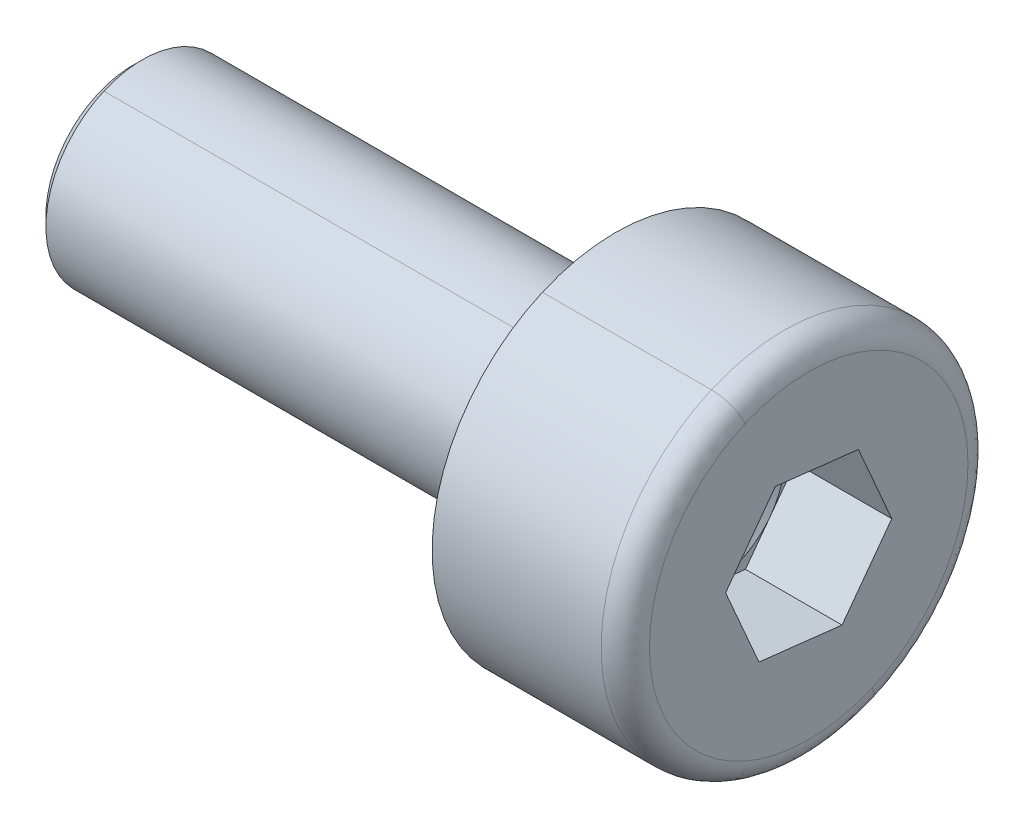
ISO-10303-21;
HEADER;
FILE_DESCRIPTION(('STEP AP214'),'2;1');
FILE_NAME('part.step','',(''),(''),'','','');
FILE_SCHEMA(('AUTOMOTIVE_DESIGN { 1 0 10303 214 1 1 1 1 }'));
ENDSEC;
DATA;
#1=APPLICATION_CONTEXT('core data for automotive mechanical design processes');
#2=APPLICATION_PROTOCOL_DEFINITION('international standard','automotive_design',2000,#1);
#3=PRODUCT_CONTEXT('',#1,'mechanical');
#4=PRODUCT('Part','Part','',(#3));
#5=PRODUCT_RELATED_PRODUCT_CATEGORY('part','',(#4));
#6=PRODUCT_DEFINITION_FORMATION('','',#4);
#7=PRODUCT_DEFINITION_CONTEXT('part definition',#1,'design');
#8=PRODUCT_DEFINITION('design','',#6,#7);
#9=PRODUCT_DEFINITION_SHAPE('','',#8);
#10=(LENGTH_UNIT() NAMED_UNIT(*) SI_UNIT(.MILLI.,.METRE.));
#11=(NAMED_UNIT(*) PLANE_ANGLE_UNIT() SI_UNIT($,.RADIAN.));
#12=(NAMED_UNIT(*) SI_UNIT($,.STERADIAN.) SOLID_ANGLE_UNIT());
#13=UNCERTAINTY_MEASURE_WITH_UNIT(LENGTH_MEASURE(1.E-05),#10,'distance_accuracy_value','');
#14=(GEOMETRIC_REPRESENTATION_CONTEXT(3) GLOBAL_UNCERTAINTY_ASSIGNED_CONTEXT((#13)) GLOBAL_UNIT_ASSIGNED_CONTEXT((#10,
#11,#12)) REPRESENTATION_CONTEXT('',''));
#15=CARTESIAN_POINT('',(0.,0.,0.));
#16=DIRECTION('',(0.,0.,1.));
#17=DIRECTION('',(1.,0.,0.));
#18=AXIS2_PLACEMENT_3D('',#15,#16,#17);
#19=CARTESIAN_POINT('',(31.89999999991,0.,17.));
#20=DIRECTION('',(1.,0.,0.));
#21=DIRECTION('',(0.,-0.917051136198339,-0.398769624717501));
#22=AXIS2_PLACEMENT_3D('',#19,#20,#21);
#23=CONICAL_SURFACE('',#22,0.749999999698048,1.04719755078461);
#24=DIRECTION('',(0.500000000356795,0.794189580328236,0.345344625180799));
#25=VECTOR('',#24,1.);
#26=CARTESIAN_POINT('',(31.89999999991,0.687788351871846,17.2990772184177));
#27=LINE('',#26,#25);
#28=CARTESIAN_POINT('',(31.4669872980623,-3.12772561488158E-10,16.999999999864));
#29=VERTEX_POINT('',#28);
#30=CARTESIAN_POINT('',(31.9000000000412,0.687788352080363,17.2990772185084));
#31=VERTEX_POINT('',#30);
#32=EDGE_CURVE('E209',#29,#31,#27,.T.);
#33=ORIENTED_EDGE('',*,*,#32,.F.);
#34=DIRECTION('',(0.500000000356795,-0.794189580328236,-0.345344625180799));
#35=VECTOR('',#34,1.);
#36=CARTESIAN_POINT('',(31.89999999991,-0.687788351871851,16.7009227815823));
#37=LINE('',#36,#35);
#38=CARTESIAN_POINT('',(31.9000000000412,-0.687788352080368,16.7009227814916));
#39=VERTEX_POINT('',#38);
#40=EDGE_CURVE('E203',#29,#39,#37,.T.);
#41=ORIENTED_EDGE('',*,*,#40,.T.);
#42=CARTESIAN_POINT('',(31.9000000000412,0.,17.));
#43=DIRECTION('',(-1.,0.,0.));
#44=DIRECTION('',(0.,-0.917051136198324,-0.398769624717534));
#45=AXIS2_PLACEMENT_3D('',#42,#43,#44);
#46=CIRCLE('',#45,0.749999999925422);
#47=CARTESIAN_POINT('',(31.9000000000206,-0.446103576096618,16.3970973550084));
#48=VERTEX_POINT('',#47);
#49=EDGE_CURVE('E11',#48,#39,#46,.T.);
#50=ORIENTED_EDGE('',*,*,#49,.F.);
#51=CARTESIAN_POINT('',(31.9000000000412,0.,17.));
#52=DIRECTION('',(-1.,0.,0.));
#53=DIRECTION('',(0.,-0.917051136198336,-0.398769624717506));
#54=AXIS2_PLACEMENT_3D('',#51,#52,#53);
#55=CIRCLE('',#54,0.749999999925422);
#56=CARTESIAN_POINT('',(31.9000000000206,0.299077218523254,16.3122116478855));
#57=VERTEX_POINT('',#56);
#58=EDGE_CURVE('E27',#57,#48,#55,.T.);
#59=ORIENTED_EDGE('',*,*,#58,.F.);
#60=CARTESIAN_POINT('',(31.9000000000412,0.,17.));
#61=DIRECTION('',(-1.,0.,0.));
#62=DIRECTION('',(0.,-0.917051136198338,-0.398769624717502));
#63=AXIS2_PLACEMENT_3D('',#60,#61,#62);
#64=CIRCLE('',#63,0.749999999925421);
#65=CARTESIAN_POINT('',(31.9000000000206,0.745180794619869,16.915114292877));
#66=VERTEX_POINT('',#65);
#67=EDGE_CURVE('E231',#66,#57,#64,.T.);
#68=ORIENTED_EDGE('',*,*,#67,.F.);
#69=CARTESIAN_POINT('',(31.9000000000412,0.,17.));
#70=DIRECTION('',(-1.,0.,0.));
#71=DIRECTION('',(0.,-0.917051136198336,-0.398769624717506));
#72=AXIS2_PLACEMENT_3D('',#69,#70,#71);
#73=CIRCLE('',#72,0.749999999925421);
#74=EDGE_CURVE('E234',#31,#66,#73,.T.);
#75=ORIENTED_EDGE('',*,*,#74,.F.);
#76=EDGE_LOOP('',(#33,#41,#50,#59,#68,#75));
#77=FACE_BOUND('',#76,.T.);
#78=ADVANCED_FACE('F16',(#77),#23,.F.);
#79=CARTESIAN_POINT('',(31.9,-0.598154437076255,18.3755767042975));
#80=DIRECTION('',(1.,0.,0.));
#81=DIRECTION('',(0.,1.,0.));
#82=AXIS2_PLACEMENT_3D('',#79,#80,#81);
#83=PLANE('',#82);
#84=CARTESIAN_POINT('',(31.9000000000412,0.,17.));
#85=DIRECTION('',(-1.,0.,0.));
#86=DIRECTION('',(0.,-0.917051136198338,-0.398769624717502));
#87=AXIS2_PLACEMENT_3D('',#84,#85,#86);
#88=CIRCLE('',#87,0.749999999925421);
#89=CARTESIAN_POINT('',(31.9000000000206,-0.745180794619875,17.084885707123));
#90=VERTEX_POINT('',#89);
#91=CARTESIAN_POINT('',(31.9000000000206,-0.299077218523259,17.6877883521146));
#92=VERTEX_POINT('',#91);
#93=EDGE_CURVE('E205',#90,#92,#88,.T.);
#94=ORIENTED_EDGE('',*,*,#93,.T.);
#95=DIRECTION('',(0.,0.917051136198338,0.398769624717501));
#96=VECTOR('',#95,1.);
#97=CARTESIAN_POINT('',(31.9,-0.696172008796701,17.5151160395173));
#98=LINE('',#97,#96);
#99=CARTESIAN_POINT('',(31.9,-0.696172008796701,17.5151160395173));
#100=VERTEX_POINT('',#99);
#101=EDGE_CURVE('E42',#100,#92,#98,.T.);
#102=ORIENTED_EDGE('',*,*,#101,.F.);
#103=DIRECTION('',(0.,0.113180942836226,0.993574392875895));
#104=VECTOR('',#103,1.);
#105=CARTESIAN_POINT('',(31.9,-0.794189580517147,16.6546553747371));
#106=LINE('',#105,#104);
#107=EDGE_CURVE('E311',#90,#100,#106,.T.);
#108=ORIENTED_EDGE('',*,*,#107,.F.);
#109=EDGE_LOOP('',(#94,#102,#108));
#110=FACE_BOUND('',#109,.T.);
#111=ADVANCED_FACE('F436',(#110),#83,.T.);
#112=CARTESIAN_POINT('',(31.9,-0.598154437076255,18.3755767042975));
#113=DIRECTION('',(1.,0.,0.));
#114=DIRECTION('',(0.,1.,0.));
#115=AXIS2_PLACEMENT_3D('',#112,#113,#114);
#116=PLANE('',#115);
#117=ORIENTED_EDGE('',*,*,#49,.T.);
#118=CARTESIAN_POINT('',(31.9000000000412,0.,17.));
#119=DIRECTION('',(-1.,0.,0.));
#120=DIRECTION('',(0.,-0.917051136198338,-0.398769624717501));
#121=AXIS2_PLACEMENT_3D('',#118,#119,#120);
#122=CIRCLE('',#121,0.749999999925422);
#123=EDGE_CURVE('E192',#39,#90,#122,.T.);
#124=ORIENTED_EDGE('',*,*,#123,.T.);
#125=DIRECTION('',(0.,0.113180942836226,0.993574392875895));
#126=VECTOR('',#125,1.);
#127=CARTESIAN_POINT('',(31.9,-0.794189580517147,16.6546553747371));
#128=LINE('',#127,#126);
#129=CARTESIAN_POINT('',(31.9,-0.794189580517147,16.6546553747371));
#130=VERTEX_POINT('',#129);
#131=EDGE_CURVE('E290',#130,#90,#128,.T.);
#132=ORIENTED_EDGE('',*,*,#131,.F.);
#133=DIRECTION('',(0.,-0.803870193362113,0.594804768158393));
#134=VECTOR('',#133,1.);
#135=CARTESIAN_POINT('',(31.9,-0.0980175717204487,16.1395393352198));
#136=LINE('',#135,#134);
#137=EDGE_CURVE('E195',#48,#130,#136,.T.);
#138=ORIENTED_EDGE('',*,*,#137,.F.);
#139=EDGE_LOOP('',(#117,#124,#132,#138));
#140=FACE_BOUND('',#139,.T.);
#141=ADVANCED_FACE('F191',(#140),#116,.T.);
#142=CARTESIAN_POINT('',(31.9,-0.598154437076255,18.3755767042975));
#143=DIRECTION('',(1.,0.,0.));
#144=DIRECTION('',(0.,1.,0.));
#145=AXIS2_PLACEMENT_3D('',#142,#143,#144);
#146=PLANE('',#145);
#147=ORIENTED_EDGE('',*,*,#58,.T.);
#148=DIRECTION('',(0.,-0.803870193362113,0.594804768158393));
#149=VECTOR('',#148,1.);
#150=CARTESIAN_POINT('',(31.9,-0.0980175717204487,16.1395393352198));
#151=LINE('',#150,#149);
#152=CARTESIAN_POINT('',(31.9,-0.0980175717204487,16.1395393352198));
#153=VERTEX_POINT('',#152);
#154=EDGE_CURVE('E300',#153,#48,#151,.T.);
#155=ORIENTED_EDGE('',*,*,#154,.F.);
#156=DIRECTION('',(0.,-0.917051136198338,-0.398769624717501));
#157=VECTOR('',#156,1.);
#158=CARTESIAN_POINT('',(31.9,0.696172008796695,16.4848839604827));
#159=LINE('',#158,#157);
#160=EDGE_CURVE('E307',#57,#153,#159,.T.);
#161=ORIENTED_EDGE('',*,*,#160,.F.);
#162=EDGE_LOOP('',(#147,#155,#161));
#163=FACE_BOUND('',#162,.T.);
#164=ADVANCED_FACE('F457',(#163),#146,.T.);
#165=CARTESIAN_POINT('',(31.9,-0.598154437076255,18.3755767042975));
#166=DIRECTION('',(1.,0.,0.));
#167=DIRECTION('',(0.,1.,0.));
#168=AXIS2_PLACEMENT_3D('',#165,#166,#167);
#169=PLANE('',#168);
#170=ORIENTED_EDGE('',*,*,#67,.T.);
#171=DIRECTION('',(0.,-0.917051136198338,-0.398769624717501));
#172=VECTOR('',#171,1.);
#173=CARTESIAN_POINT('',(31.9,0.696172008796695,16.4848839604827));
#174=LINE('',#173,#172);
#175=CARTESIAN_POINT('',(31.9,0.696172008796695,16.4848839604827));
#176=VERTEX_POINT('',#175);
#177=EDGE_CURVE('E321',#176,#57,#174,.T.);
#178=ORIENTED_EDGE('',*,*,#177,.F.);
#179=DIRECTION('',(0.,-0.113180942836226,-0.993574392875895));
#180=VECTOR('',#179,1.);
#181=CARTESIAN_POINT('',(31.9,0.794189580517142,17.3453446252629));
#182=LINE('',#181,#180);
#183=EDGE_CURVE('E20',#66,#176,#182,.T.);
#184=ORIENTED_EDGE('',*,*,#183,.F.);
#185=EDGE_LOOP('',(#170,#178,#184));
#186=FACE_BOUND('',#185,.T.);
#187=ADVANCED_FACE('F449',(#186),#169,.T.);
#188=CARTESIAN_POINT('',(31.9,-0.598154437076255,18.3755767042975));
#189=DIRECTION('',(1.,0.,0.));
#190=DIRECTION('',(0.,1.,0.));
#191=AXIS2_PLACEMENT_3D('',#188,#189,#190);
#192=PLANE('',#191);
#193=CARTESIAN_POINT('',(31.9000000000412,0.,17.));
#194=DIRECTION('',(-1.,0.,0.));
#195=DIRECTION('',(0.,-0.917051136198336,-0.398769624717506));
#196=AXIS2_PLACEMENT_3D('',#193,#194,#195);
#197=CIRCLE('',#196,0.749999999925422);
#198=CARTESIAN_POINT('',(31.9000000000206,0.446103576096613,17.6029026449916));
#199=VERTEX_POINT('',#198);
#200=EDGE_CURVE('E336',#92,#199,#197,.T.);
#201=ORIENTED_EDGE('',*,*,#200,.T.);
#202=DIRECTION('',(0.,0.803870193362112,-0.594804768158393));
#203=VECTOR('',#202,1.);
#204=CARTESIAN_POINT('',(31.9,0.098017571720444,17.8604606647802));
#205=LINE('',#204,#203);
#206=CARTESIAN_POINT('',(31.9,0.0980175717204439,17.8604606647802));
#207=VERTEX_POINT('',#206);
#208=EDGE_CURVE('E253',#207,#199,#205,.T.);
#209=ORIENTED_EDGE('',*,*,#208,.F.);
#210=DIRECTION('',(0.,0.917051136198338,0.398769624717501));
#211=VECTOR('',#210,1.);
#212=CARTESIAN_POINT('',(31.9,-0.696172008796701,17.5151160395173));
#213=LINE('',#212,#211);
#214=EDGE_CURVE('E235',#92,#207,#213,.T.);
#215=ORIENTED_EDGE('',*,*,#214,.F.);
#216=EDGE_LOOP('',(#201,#209,#215));
#217=FACE_BOUND('',#216,.T.);
#218=ADVANCED_FACE('F446',(#217),#192,.T.);
#219=CARTESIAN_POINT('',(31.9,-0.598154437076255,18.3755767042975));
#220=DIRECTION('',(1.,0.,0.));
#221=DIRECTION('',(0.,1.,0.));
#222=AXIS2_PLACEMENT_3D('',#219,#220,#221);
#223=PLANE('',#222);
#224=CARTESIAN_POINT('',(31.9000000000412,0.,17.));
#225=DIRECTION('',(-1.,0.,0.));
#226=DIRECTION('',(0.,-0.91705113619834,-0.398769624717497));
#227=AXIS2_PLACEMENT_3D('',#224,#225,#226);
#228=CIRCLE('',#227,0.749999999925422);
#229=EDGE_CURVE('E216',#199,#31,#228,.T.);
#230=ORIENTED_EDGE('',*,*,#229,.T.);
#231=ORIENTED_EDGE('',*,*,#74,.T.);
#232=DIRECTION('',(0.,-0.113180942836226,-0.993574392875895));
#233=VECTOR('',#232,1.);
#234=CARTESIAN_POINT('',(31.9,0.794189580517142,17.3453446252629));
#235=LINE('',#234,#233);
#236=CARTESIAN_POINT('',(31.9,0.794189580517142,17.3453446252629));
#237=VERTEX_POINT('',#236);
#238=EDGE_CURVE('E303',#237,#66,#235,.T.);
#239=ORIENTED_EDGE('',*,*,#238,.F.);
#240=DIRECTION('',(0.,0.803870193362112,-0.594804768158393));
#241=VECTOR('',#240,1.);
#242=CARTESIAN_POINT('',(31.9,0.098017571720444,17.8604606647802));
#243=LINE('',#242,#241);
#244=EDGE_CURVE('E240',#199,#237,#243,.T.);
#245=ORIENTED_EDGE('',*,*,#244,.F.);
#246=EDGE_LOOP('',(#230,#231,#239,#245));
#247=FACE_BOUND('',#246,.T.);
#248=ADVANCED_FACE('F448',(#247),#223,.T.);
#249=CARTESIAN_POINT('',(31.9,-0.696172008796701,17.5151160395173));
#250=DIRECTION('',(0.,0.398769624717501,-0.917051136198338));
#251=DIRECTION('',(-1.,0.,0.));
#252=AXIS2_PLACEMENT_3D('',#249,#250,#251);
#253=PLANE('',#252);
#254=ORIENTED_EDGE('',*,*,#214,.T.);
#255=DIRECTION('',(-1.,0.,0.));
#256=VECTOR('',#255,1.);
#257=CARTESIAN_POINT('',(31.9,0.098017571720444,17.8604606647802));
#258=LINE('',#257,#256);
#259=CARTESIAN_POINT('',(32.9,0.098017571720444,17.8604606647802));
#260=VERTEX_POINT('',#259);
#261=EDGE_CURVE('E239',#260,#207,#258,.T.);
#262=ORIENTED_EDGE('',*,*,#261,.F.);
#263=DIRECTION('',(0.,-0.917051136198338,-0.398769624717501));
#264=VECTOR('',#263,1.);
#265=CARTESIAN_POINT('',(32.9,-0.299077218538129,17.6877883521488));
#266=LINE('',#265,#264);
#267=CARTESIAN_POINT('',(32.9,-0.696172008796701,17.5151160395173));
#268=VERTEX_POINT('',#267);
#269=EDGE_CURVE('E245',#260,#268,#266,.T.);
#270=ORIENTED_EDGE('',*,*,#269,.T.);
#271=DIRECTION('',(1.,0.,0.));
#272=VECTOR('',#271,1.);
#273=CARTESIAN_POINT('',(31.9,-0.696172008796701,17.5151160395173));
#274=LINE('',#273,#272);
#275=EDGE_CURVE('E293',#100,#268,#274,.T.);
#276=ORIENTED_EDGE('',*,*,#275,.F.);
#277=ORIENTED_EDGE('',*,*,#101,.T.);
#278=EDGE_LOOP('',(#254,#262,#270,#276,#277));
#279=FACE_BOUND('',#278,.T.);
#280=ADVANCED_FACE('F454',(#279),#253,.T.);
#281=CARTESIAN_POINT('',(31.9,-0.794189580517147,16.6546553747371));
#282=DIRECTION('',(0.,0.993574392875895,-0.113180942836226));
#283=DIRECTION('',(-1.,0.,0.));
#284=AXIS2_PLACEMENT_3D('',#281,#282,#283);
#285=PLANE('',#284);
#286=ORIENTED_EDGE('',*,*,#107,.T.);
#287=ORIENTED_EDGE('',*,*,#275,.T.);
#288=DIRECTION('',(0.,-0.113180942836226,-0.993574392875895));
#289=VECTOR('',#288,1.);
#290=CARTESIAN_POINT('',(32.9,-0.696172008796701,17.5151160395173));
#291=LINE('',#290,#289);
#292=CARTESIAN_POINT('',(32.9,-0.794189580517147,16.6546553747371));
#293=VERTEX_POINT('',#292);
#294=EDGE_CURVE('E249',#268,#293,#291,.T.);
#295=ORIENTED_EDGE('',*,*,#294,.T.);
#296=DIRECTION('',(1.,0.,0.));
#297=VECTOR('',#296,1.);
#298=CARTESIAN_POINT('',(31.9,-0.794189580517147,16.6546553747371));
#299=LINE('',#298,#297);
#300=EDGE_CURVE('E297',#130,#293,#299,.T.);
#301=ORIENTED_EDGE('',*,*,#300,.F.);
#302=ORIENTED_EDGE('',*,*,#131,.T.);
#303=EDGE_LOOP('',(#286,#287,#295,#301,#302));
#304=FACE_BOUND('',#303,.T.);
#305=ADVANCED_FACE('F471',(#304),#285,.T.);
#306=CARTESIAN_POINT('',(31.9,-0.0980175717204487,16.1395393352198));
#307=DIRECTION('',(0.,0.594804768158393,0.803870193362113));
#308=DIRECTION('',(1.,0.,0.));
#309=AXIS2_PLACEMENT_3D('',#306,#307,#308);
#310=PLANE('',#309);
#311=ORIENTED_EDGE('',*,*,#137,.T.);
#312=ORIENTED_EDGE('',*,*,#300,.T.);
#313=DIRECTION('',(0.,0.803870193362113,-0.594804768158393));
#314=VECTOR('',#313,1.);
#315=CARTESIAN_POINT('',(32.9,-0.794189580517147,16.6546553747371));
#316=LINE('',#315,#314);
#317=CARTESIAN_POINT('',(32.9,-0.0980175717204487,16.1395393352198));
#318=VERTEX_POINT('',#317);
#319=EDGE_CURVE('E263',#293,#318,#316,.T.);
#320=ORIENTED_EDGE('',*,*,#319,.T.);
#321=DIRECTION('',(1.,0.,0.));
#322=VECTOR('',#321,1.);
#323=CARTESIAN_POINT('',(31.9,-0.0980175717204487,16.1395393352198));
#324=LINE('',#323,#322);
#325=EDGE_CURVE('E325',#153,#318,#324,.T.);
#326=ORIENTED_EDGE('',*,*,#325,.F.);
#327=ORIENTED_EDGE('',*,*,#154,.T.);
#328=EDGE_LOOP('',(#311,#312,#320,#326,#327));
#329=FACE_BOUND('',#328,.T.);
#330=ADVANCED_FACE('F444',(#329),#310,.T.);
#331=CARTESIAN_POINT('',(31.9,0.696172008796695,16.4848839604827));
#332=DIRECTION('',(0.,-0.398769624717501,0.917051136198338));
#333=DIRECTION('',(-1.,0.,0.));
#334=AXIS2_PLACEMENT_3D('',#331,#332,#333);
#335=PLANE('',#334);
#336=ORIENTED_EDGE('',*,*,#160,.T.);
#337=ORIENTED_EDGE('',*,*,#325,.T.);
#338=DIRECTION('',(0.,0.917051136198338,0.398769624717501));
#339=VECTOR('',#338,1.);
#340=CARTESIAN_POINT('',(32.9,0.299077218538123,16.3122116478513));
#341=LINE('',#340,#339);
#342=CARTESIAN_POINT('',(32.9,0.696172008796695,16.4848839604827));
#343=VERTEX_POINT('',#342);
#344=EDGE_CURVE('E289',#318,#343,#341,.T.);
#345=ORIENTED_EDGE('',*,*,#344,.T.);
#346=DIRECTION('',(1.,0.,0.));
#347=VECTOR('',#346,1.);
#348=CARTESIAN_POINT('',(31.9,0.696172008796695,16.4848839604827));
#349=LINE('',#348,#347);
#350=EDGE_CURVE('E308',#176,#343,#349,.T.);
#351=ORIENTED_EDGE('',*,*,#350,.F.);
#352=ORIENTED_EDGE('',*,*,#177,.T.);
#353=EDGE_LOOP('',(#336,#337,#345,#351,#352));
#354=FACE_BOUND('',#353,.T.);
#355=ADVANCED_FACE('F441',(#354),#335,.T.);
#356=CARTESIAN_POINT('',(31.9,0.794189580517142,17.3453446252629));
#357=DIRECTION('',(0.,-0.993574392875895,0.113180942836226));
#358=DIRECTION('',(-1.,0.,0.));
#359=AXIS2_PLACEMENT_3D('',#356,#357,#358);
#360=PLANE('',#359);
#361=ORIENTED_EDGE('',*,*,#183,.T.);
#362=ORIENTED_EDGE('',*,*,#350,.T.);
#363=DIRECTION('',(0.,0.113180942836226,0.993574392875895));
#364=VECTOR('',#363,1.);
#365=CARTESIAN_POINT('',(32.9,0.696172008796695,16.4848839604827));
#366=LINE('',#365,#364);
#367=CARTESIAN_POINT('',(32.9,0.794189580517142,17.3453446252629));
#368=VERTEX_POINT('',#367);
#369=EDGE_CURVE('E275',#343,#368,#366,.T.);
#370=ORIENTED_EDGE('',*,*,#369,.T.);
#371=DIRECTION('',(1.,0.,0.));
#372=VECTOR('',#371,1.);
#373=CARTESIAN_POINT('',(31.9,0.794189580517142,17.3453446252629));
#374=LINE('',#373,#372);
#375=EDGE_CURVE('E236',#237,#368,#374,.T.);
#376=ORIENTED_EDGE('',*,*,#375,.F.);
#377=ORIENTED_EDGE('',*,*,#238,.T.);
#378=EDGE_LOOP('',(#361,#362,#370,#376,#377));
#379=FACE_BOUND('',#378,.T.);
#380=ADVANCED_FACE('F429',(#379),#360,.T.);
#381=CARTESIAN_POINT('',(31.9,0.098017571720444,17.8604606647802));
#382=DIRECTION('',(0.,-0.594804768158393,-0.803870193362113));
#383=DIRECTION('',(0.,-0.803870193362113,0.594804768158393));
#384=AXIS2_PLACEMENT_3D('',#381,#382,#383);
#385=PLANE('',#384);
#386=ORIENTED_EDGE('',*,*,#244,.T.);
#387=ORIENTED_EDGE('',*,*,#375,.T.);
#388=DIRECTION('',(0.,-0.803870193362112,0.594804768158393));
#389=VECTOR('',#388,1.);
#390=CARTESIAN_POINT('',(32.9,0.794189580517142,17.3453446252629));
#391=LINE('',#390,#389);
#392=EDGE_CURVE('E248',#368,#260,#391,.T.);
#393=ORIENTED_EDGE('',*,*,#392,.T.);
#394=ORIENTED_EDGE('',*,*,#261,.T.);
#395=ORIENTED_EDGE('',*,*,#208,.T.);
#396=EDGE_LOOP('',(#386,#387,#393,#394,#395));
#397=FACE_BOUND('',#396,.T.);
#398=ADVANCED_FACE('F421',(#397),#385,.T.);
#399=CARTESIAN_POINT('',(32.9,0.,17.));
#400=DIRECTION('',(-1.,0.,0.));
#401=DIRECTION('',(0.,0.,1.));
#402=AXIS2_PLACEMENT_3D('',#399,#400,#401);
#403=PLANE('',#402);
#404=ORIENTED_EDGE('',*,*,#369,.F.);
#405=ORIENTED_EDGE('',*,*,#344,.F.);
#406=ORIENTED_EDGE('',*,*,#319,.F.);
#407=ORIENTED_EDGE('',*,*,#294,.F.);
#408=ORIENTED_EDGE('',*,*,#269,.F.);
#409=ORIENTED_EDGE('',*,*,#392,.F.);
#410=EDGE_LOOP('',(#404,#405,#406,#407,#408,#409));
#411=FACE_BOUND('',#410,.T.);
#412=CARTESIAN_POINT('',(32.9,1.51313437472725,17.6579698807839));
#413=CARTESIAN_POINT('',(32.9,2.82907413629501,14.6317011313294));
#414=CARTESIAN_POINT('',(32.9,-0.197194613159505,13.3157613697616));
#415=CARTESIAN_POINT('',(32.9,-1.51313437472726,16.3420301192161));
#416=(BOUNDED_CURVE() B_SPLINE_CURVE(3,(#412,#413,#414,#415),.UNSPECIFIED.,.F.,
.F.) B_SPLINE_CURVE_WITH_KNOTS((4,4),(0.,1.),
.UNSPECIFIED.) CURVE() GEOMETRIC_REPRESENTATION_ITEM() RATIONAL_B_SPLINE_CURVE((1.,
0.333333333333334,0.333333333333334,1.)) REPRESENTATION_ITEM(''));
#417=CARTESIAN_POINT('',(32.9,1.51313437472725,17.6579698807839));
#418=VERTEX_POINT('',#417);
#419=CARTESIAN_POINT('',(32.9,-1.51313437472726,16.3420301192161));
#420=VERTEX_POINT('',#419);
#421=EDGE_CURVE('E270',#418,#420,#416,.T.);
#422=ORIENTED_EDGE('',*,*,#421,.F.);
#423=CARTESIAN_POINT('',(32.9,-1.51313437472726,16.3420301192161));
#424=CARTESIAN_POINT('',(32.9,-2.82907413629502,19.3682988686706));
#425=CARTESIAN_POINT('',(32.9,0.1971946131595,20.6842386302384));
#426=CARTESIAN_POINT('',(32.9,1.51313437472725,17.6579698807839));
#427=(BOUNDED_CURVE() B_SPLINE_CURVE(3,(#423,#424,#425,#426),.UNSPECIFIED.,.F.,
.F.) B_SPLINE_CURVE_WITH_KNOTS((4,4),(0.,1.),
.UNSPECIFIED.) CURVE() GEOMETRIC_REPRESENTATION_ITEM() RATIONAL_B_SPLINE_CURVE((1.,
0.333333333333334,0.333333333333334,1.)) REPRESENTATION_ITEM(''));
#428=EDGE_CURVE('E228',#420,#418,#427,.T.);
#429=ORIENTED_EDGE('',*,*,#428,.F.);
#430=EDGE_LOOP('',(#422,#429));
#431=FACE_BOUND('',#430,.T.);
#432=ADVANCED_FACE('F419',(#411,#431),#403,.F.);
#433=CARTESIAN_POINT('',(32.65,1.74239715877684,17.7576622869632));
#434=CARTESIAN_POINT('',(32.6499999999999,3.25772173270335,14.2728679694096));
#435=CARTESIAN_POINT('',(32.6499999999999,-0.227072584850337,12.7575433954831));
#436=CARTESIAN_POINT('',(32.65,-1.74239715877684,16.2423377130368));
#437=CARTESIAN_POINT('',(32.7964466094068,1.74239715877684,17.7576622869632));
#438=CARTESIAN_POINT('',(32.7964466094067,3.25772173270335,14.2728679694096));
#439=CARTESIAN_POINT('',(32.7964466094067,-0.227072584850337,12.7575433954831));
#440=CARTESIAN_POINT('',(32.7964466094068,-1.74239715877685,16.2423377130368));
#441=CARTESIAN_POINT('',(32.9,1.64743340427609,17.7163683402582));
#442=CARTESIAN_POINT('',(32.9,3.08017008479239,14.421501531706));
#443=CARTESIAN_POINT('',(32.9,-0.214696723759794,12.9887648511897));
#444=CARTESIAN_POINT('',(32.9,-1.64743340427609,16.2836316597418));
#445=CARTESIAN_POINT('',(32.9,1.51313437472725,17.6579698807839));
#446=CARTESIAN_POINT('',(32.9,2.82907413629501,14.6317011313294));
#447=CARTESIAN_POINT('',(32.9,-0.197194613159505,13.3157613697616));
#448=CARTESIAN_POINT('',(32.9,-1.51313437472726,16.3420301192161));
#449=(BOUNDED_SURFACE() B_SPLINE_SURFACE(3,3,((#433,#434,#435,#436),(#437,#438,#439,#440),(#441,
#442,#443,#444),(#445,#446,#447,#448)),.UNSPECIFIED.,.F.,.F.,
.F.) B_SPLINE_SURFACE_WITH_KNOTS((4,4),(4,4),(0.,1.),(0.,1.),
.UNSPECIFIED.) GEOMETRIC_REPRESENTATION_ITEM() RATIONAL_B_SPLINE_SURFACE(((1.,0.333333333333334,
0.333333333333334,1.),(0.804737854124365,0.268245951374788,0.268245951374788,0.804737854124365),
(0.804737854124365,0.268245951374788,0.268245951374788,0.804737854124365),(1.,0.333333333333334,
0.333333333333334,1.))) REPRESENTATION_ITEM('') SURFACE());
#450=CARTESIAN_POINT('',(32.65,-1.51313437472726,16.3420301192161));
#451=DIRECTION('',(0.,-0.398769624717506,0.917051136198336));
#452=DIRECTION('',(0.,-0.917051136198336,-0.398769624717506));
#453=AXIS2_PLACEMENT_3D('',#450,#451,#452);
#454=CIRCLE('',#453,0.25);
#455=CARTESIAN_POINT('',(32.65,-1.74239715877684,16.2423377130368));
#456=VERTEX_POINT('',#455);
#457=EDGE_CURVE('E255',#456,#420,#454,.T.);
#458=CARTESIAN_POINT('',(32.65,0.,17.));
#459=DIRECTION('',(-1.,0.,0.));
#460=DIRECTION('',(0.,-0.917051136198339,-0.3987696247175));
#461=AXIS2_PLACEMENT_3D('',#458,#459,#460);
#462=CIRCLE('',#461,1.9);
#463=CARTESIAN_POINT('',(32.65,1.74239715877684,17.7576622869632));
#464=VERTEX_POINT('',#463);
#465=EDGE_CURVE('E117',#464,#456,#462,.T.);
#466=CARTESIAN_POINT('',(32.65,1.51313437472725,17.6579698807839));
#467=DIRECTION('',(0.,0.398769624717506,-0.917051136198336));
#468=DIRECTION('',(0.,0.917051136198336,0.398769624717506));
#469=AXIS2_PLACEMENT_3D('',#466,#467,#468);
#470=CIRCLE('',#469,0.25);
#471=EDGE_CURVE('E224',#464,#418,#470,.T.);
#472=ORIENTED_EDGE('',*,*,#457,.F.);
#473=ORIENTED_EDGE('',*,*,#465,.F.);
#474=ORIENTED_EDGE('',*,*,#471,.T.);
#475=ORIENTED_EDGE('',*,*,#421,.T.);
#476=EDGE_LOOP('',(#472,#473,#474,#475));
#477=FACE_BOUND('',#476,.T.);
#478=ADVANCED_FACE('F414',(#477),#449,.T.);
#479=CARTESIAN_POINT('',(25.9,0.,17.));
#480=DIRECTION('',(-1.,0.,0.));
#481=DIRECTION('',(0.,0.,1.));
#482=AXIS2_PLACEMENT_3D('',#479,#480,#481);
#483=PLANE('',#482);
#484=CARTESIAN_POINT('',(25.899999999995,0.,17.));
#485=DIRECTION('',(1.,0.,0.));
#486=DIRECTION('',(0.,-0.398769624717502,0.917051136198338));
#487=AXIS2_PLACEMENT_3D('',#484,#485,#486);
#488=CIRCLE('',#487,0.900000000058299);
#489=CARTESIAN_POINT('',(25.899999999995,-0.358892662269002,17.825346022632));
#490=VERTEX_POINT('',#489);
#491=CARTESIAN_POINT('',(25.899999999995,0.358892662268997,16.1746539773681));
#492=VERTEX_POINT('',#491);
#493=EDGE_CURVE('E268',#490,#492,#488,.T.);
#494=ORIENTED_EDGE('',*,*,#493,.F.);
#495=CARTESIAN_POINT('',(25.899999999995,0.,17.));
#496=DIRECTION('',(1.,0.,0.));
#497=DIRECTION('',(0.,-0.398769624717502,0.917051136198338));
#498=AXIS2_PLACEMENT_3D('',#495,#496,#497);
#499=CIRCLE('',#498,0.900000000058299);
#500=EDGE_CURVE('E276',#492,#490,#499,.T.);
#501=ORIENTED_EDGE('',*,*,#500,.F.);
#502=EDGE_LOOP('',(#494,#501));
#503=FACE_BOUND('',#502,.T.);
#504=ADVANCED_FACE('F18',(#503),#483,.T.);
#505=CARTESIAN_POINT('',(30.9,0.,17.));
#506=DIRECTION('',(1.,0.,0.));
#507=DIRECTION('',(0.,-0.917051136198338,-0.398769624717502));
#508=AXIS2_PLACEMENT_3D('',#505,#506,#507);
#509=CYLINDRICAL_SURFACE('',#508,1.9);
#510=DIRECTION('',(1.,0.,0.));
#511=VECTOR('',#510,1.);
#512=CARTESIAN_POINT('',(30.9,1.74239715877684,17.7576622869632));
#513=LINE('',#512,#511);
#514=CARTESIAN_POINT('',(30.9,1.74239715877684,17.7576622869632));
#515=VERTEX_POINT('',#514);
#516=EDGE_CURVE('E317',#515,#464,#513,.T.);
#517=ORIENTED_EDGE('',*,*,#516,.F.);
#518=CARTESIAN_POINT('',(30.9,0.,17.));
#519=DIRECTION('',(-1.,0.,0.));
#520=DIRECTION('',(0.,-0.917051136198339,-0.3987696247175));
#521=AXIS2_PLACEMENT_3D('',#518,#519,#520);
#522=CIRCLE('',#521,1.9);
#523=CARTESIAN_POINT('',(30.9,-1.74239715877684,16.2423377130368));
#524=VERTEX_POINT('',#523);
#525=EDGE_CURVE('E222',#524,#515,#522,.T.);
#526=ORIENTED_EDGE('',*,*,#525,.F.);
#527=DIRECTION('',(1.,0.,0.));
#528=VECTOR('',#527,1.);
#529=CARTESIAN_POINT('',(30.9,-1.74239715877684,16.2423377130368));
#530=LINE('',#529,#528);
#531=EDGE_CURVE('E132',#524,#456,#530,.T.);
#532=ORIENTED_EDGE('',*,*,#531,.T.);
#533=CARTESIAN_POINT('',(32.65,0.,17.));
#534=DIRECTION('',(-1.,0.,0.));
#535=DIRECTION('',(0.,-0.917051136198339,-0.3987696247175));
#536=AXIS2_PLACEMENT_3D('',#533,#534,#535);
#537=CIRCLE('',#536,1.9);
#538=EDGE_CURVE('E259',#456,#464,#537,.T.);
#539=ORIENTED_EDGE('',*,*,#538,.T.);
#540=EDGE_LOOP('',(#517,#526,#532,#539));
#541=FACE_BOUND('',#540,.T.);
#542=ADVANCED_FACE('F409',(#541),#509,.T.);
#543=CARTESIAN_POINT('',(25.9999999999699,0.,17.));
#544=DIRECTION('',(1.,0.,0.));
#545=DIRECTION('',(0.,-0.398769624717502,0.917051136198338));
#546=AXIS2_PLACEMENT_3D('',#543,#544,#545);
#547=CONICAL_SURFACE('',#546,1.0000000000332,0.785398163397448);
#548=DIRECTION('',(0.707106781186548,0.28197270576896,-0.648453077100673));
#549=VECTOR('',#548,1.);
#550=CARTESIAN_POINT('',(25.9999999999699,0.398769624730737,16.0829488637712));
#551=LINE('',#550,#549);
#552=CARTESIAN_POINT('',(26.,0.398769624742741,16.0829488637436));
#553=VERTEX_POINT('',#552);
#554=EDGE_CURVE('E283',#492,#553,#551,.T.);
#555=ORIENTED_EDGE('',*,*,#554,.F.);
#556=ORIENTED_EDGE('',*,*,#500,.T.);
#557=DIRECTION('',(0.707106781186547,-0.28197270576896,0.648453077100673));
#558=VECTOR('',#557,1.);
#559=CARTESIAN_POINT('',(25.9999999999699,-0.398769624730742,17.9170511362288));
#560=LINE('',#559,#558);
#561=CARTESIAN_POINT('',(26.,-0.398769624742747,17.9170511362564));
#562=VERTEX_POINT('',#561);
#563=EDGE_CURVE('E331',#490,#562,#560,.T.);
#564=ORIENTED_EDGE('',*,*,#563,.T.);
#565=CARTESIAN_POINT('',(26.,0.,17.));
#566=DIRECTION('',(1.,0.,0.));
#567=DIRECTION('',(0.,-0.917051136198339,-0.3987696247175));
#568=AXIS2_PLACEMENT_3D('',#565,#566,#567);
#569=CIRCLE('',#568,1.);
#570=CARTESIAN_POINT('',(26.,0.917051136198336,17.3987696247175));
#571=VERTEX_POINT('',#570);
#572=EDGE_CURVE('E207',#571,#562,#569,.T.);
#573=ORIENTED_EDGE('',*,*,#572,.F.);
#574=CARTESIAN_POINT('',(26.,0.,17.));
#575=DIRECTION('',(1.,0.,0.));
#576=DIRECTION('',(0.,-0.917051136198339,-0.3987696247175));
#577=AXIS2_PLACEMENT_3D('',#574,#575,#576);
#578=CIRCLE('',#577,1.);
#579=EDGE_CURVE('E227',#553,#571,#578,.T.);
#580=ORIENTED_EDGE('',*,*,#579,.F.);
#581=EDGE_LOOP('',(#555,#556,#564,#573,#580));
#582=FACE_BOUND('',#581,.T.);
#583=ADVANCED_FACE('F404',(#582),#547,.T.);
#584=CARTESIAN_POINT('',(30.9,0.,17.));
#585=DIRECTION('',(-1.,0.,0.));
#586=DIRECTION('',(0.,0.,1.));
#587=AXIS2_PLACEMENT_3D('',#584,#585,#586);
#588=PLANE('',#587);
#589=CARTESIAN_POINT('',(30.9,0.,17.));
#590=DIRECTION('',(-1.,0.,0.));
#591=DIRECTION('',(0.,-0.917051136198339,-0.3987696247175));
#592=AXIS2_PLACEMENT_3D('',#589,#590,#591);
#593=CIRCLE('',#592,1.);
#594=CARTESIAN_POINT('',(30.9,-0.917051136198341,16.6012303752825));
#595=VERTEX_POINT('',#594);
#596=CARTESIAN_POINT('',(30.9,0.917051136198336,17.3987696247175));
#597=VERTEX_POINT('',#596);
#598=EDGE_CURVE('E342',#595,#597,#593,.T.);
#599=ORIENTED_EDGE('',*,*,#598,.F.);
#600=CARTESIAN_POINT('',(30.9,0.,17.));
#601=DIRECTION('',(-1.,0.,0.));
#602=DIRECTION('',(0.,-0.917051136198337,-0.398769624717503));
#603=AXIS2_PLACEMENT_3D('',#600,#601,#602);
#604=CIRCLE('',#603,1.);
#605=EDGE_CURVE('E356',#597,#595,#604,.T.);
#606=ORIENTED_EDGE('',*,*,#605,.F.);
#607=EDGE_LOOP('',(#599,#606));
#608=FACE_BOUND('',#607,.T.);
#609=ORIENTED_EDGE('',*,*,#525,.T.);
#610=CARTESIAN_POINT('',(30.9,0.,17.));
#611=DIRECTION('',(-1.,0.,0.));
#612=DIRECTION('',(0.,-0.917051136198339,-0.3987696247175));
#613=AXIS2_PLACEMENT_3D('',#610,#611,#612);
#614=CIRCLE('',#613,1.9);
#615=EDGE_CURVE('E345',#515,#524,#614,.T.);
#616=ORIENTED_EDGE('',*,*,#615,.T.);
#617=EDGE_LOOP('',(#609,#616));
#618=FACE_BOUND('',#617,.T.);
#619=ADVANCED_FACE('F401',(#608,#618),#588,.T.);
#620=CARTESIAN_POINT('',(25.9,0.,17.));
#621=DIRECTION('',(1.,0.,0.));
#622=DIRECTION('',(0.,-0.917051136198339,-0.3987696247175));
#623=AXIS2_PLACEMENT_3D('',#620,#621,#622);
#624=CYLINDRICAL_SURFACE('',#623,1.);
#625=DIRECTION('',(1.,0.,0.));
#626=VECTOR('',#625,1.);
#627=CARTESIAN_POINT('',(25.9,0.917051136198336,17.3987696247175));
#628=LINE('',#627,#626);
#629=EDGE_CURVE('E244',#571,#597,#628,.T.);
#630=ORIENTED_EDGE('',*,*,#629,.F.);
#631=ORIENTED_EDGE('',*,*,#572,.T.);
#632=CARTESIAN_POINT('',(26.,0.,17.));
#633=DIRECTION('',(1.,0.,0.));
#634=DIRECTION('',(0.,-0.917051136198339,-0.3987696247175));
#635=AXIS2_PLACEMENT_3D('',#632,#633,#634);
#636=CIRCLE('',#635,1.);
#637=CARTESIAN_POINT('',(26.,-0.917051136198341,16.6012303752825));
#638=VERTEX_POINT('',#637);
#639=EDGE_CURVE('E296',#562,#638,#636,.T.);
#640=ORIENTED_EDGE('',*,*,#639,.T.);
#641=DIRECTION('',(1.,0.,0.));
#642=VECTOR('',#641,1.);
#643=CARTESIAN_POINT('',(25.9,-0.917051136198341,16.6012303752825));
#644=LINE('',#643,#642);
#645=EDGE_CURVE('E269',#638,#595,#644,.T.);
#646=ORIENTED_EDGE('',*,*,#645,.T.);
#647=ORIENTED_EDGE('',*,*,#598,.T.);
#648=EDGE_LOOP('',(#630,#631,#640,#646,#647));
#649=FACE_BOUND('',#648,.T.);
#650=ADVANCED_FACE('F394',(#649),#624,.T.);
#651=CARTESIAN_POINT('',(31.89999999991,0.,17.));
#652=DIRECTION('',(1.,0.,0.));
#653=DIRECTION('',(0.,-0.917051136198339,-0.398769624717501));
#654=AXIS2_PLACEMENT_3D('',#651,#652,#653);
#655=CONICAL_SURFACE('',#654,0.749999999698048,1.04719755078461);
#656=ORIENTED_EDGE('',*,*,#40,.F.);
#657=ORIENTED_EDGE('',*,*,#32,.T.);
#658=ORIENTED_EDGE('',*,*,#229,.F.);
#659=ORIENTED_EDGE('',*,*,#200,.F.);
#660=ORIENTED_EDGE('',*,*,#93,.F.);
#661=ORIENTED_EDGE('',*,*,#123,.F.);
#662=EDGE_LOOP('',(#656,#657,#658,#659,#660,#661));
#663=FACE_BOUND('',#662,.T.);
#664=ADVANCED_FACE('F201',(#663),#655,.F.);
#665=CARTESIAN_POINT('',(30.9,0.,17.));
#666=DIRECTION('',(1.,0.,0.));
#667=DIRECTION('',(0.,-0.917051136198338,-0.398769624717502));
#668=AXIS2_PLACEMENT_3D('',#665,#666,#667);
#669=CYLINDRICAL_SURFACE('',#668,1.9);
#670=ORIENTED_EDGE('',*,*,#615,.F.);
#671=ORIENTED_EDGE('',*,*,#516,.T.);
#672=ORIENTED_EDGE('',*,*,#465,.T.);
#673=ORIENTED_EDGE('',*,*,#531,.F.);
#674=EDGE_LOOP('',(#670,#671,#672,#673));
#675=FACE_BOUND('',#674,.T.);
#676=ADVANCED_FACE('F413',(#675),#669,.T.);
#677=CARTESIAN_POINT('',(25.9999999999699,0.,17.));
#678=DIRECTION('',(1.,0.,0.));
#679=DIRECTION('',(0.,-0.398769624717502,0.917051136198338));
#680=AXIS2_PLACEMENT_3D('',#677,#678,#679);
#681=CONICAL_SURFACE('',#680,1.0000000000332,0.785398163397448);
#682=ORIENTED_EDGE('',*,*,#493,.T.);
#683=ORIENTED_EDGE('',*,*,#554,.T.);
#684=CARTESIAN_POINT('',(26.,0.,17.));
#685=DIRECTION('',(1.,0.,0.));
#686=DIRECTION('',(0.,-0.917051136198339,-0.3987696247175));
#687=AXIS2_PLACEMENT_3D('',#684,#685,#686);
#688=CIRCLE('',#687,1.);
#689=EDGE_CURVE('E264',#638,#553,#688,.T.);
#690=ORIENTED_EDGE('',*,*,#689,.F.);
#691=ORIENTED_EDGE('',*,*,#639,.F.);
#692=ORIENTED_EDGE('',*,*,#563,.F.);
#693=EDGE_LOOP('',(#682,#683,#690,#691,#692));
#694=FACE_BOUND('',#693,.T.);
#695=ADVANCED_FACE('F489',(#694),#681,.T.);
#696=CARTESIAN_POINT('',(25.9,0.,17.));
#697=DIRECTION('',(1.,0.,0.));
#698=DIRECTION('',(0.,-0.917051136198339,-0.3987696247175));
#699=AXIS2_PLACEMENT_3D('',#696,#697,#698);
#700=CYLINDRICAL_SURFACE('',#699,1.);
#701=ORIENTED_EDGE('',*,*,#579,.T.);
#702=ORIENTED_EDGE('',*,*,#629,.T.);
#703=ORIENTED_EDGE('',*,*,#605,.T.);
#704=ORIENTED_EDGE('',*,*,#645,.F.);
#705=ORIENTED_EDGE('',*,*,#689,.T.);
#706=EDGE_LOOP('',(#701,#702,#703,#704,#705));
#707=FACE_BOUND('',#706,.T.);
#708=ADVANCED_FACE('F399',(#707),#700,.T.);
#709=CARTESIAN_POINT('',(32.65,-1.74239715877684,16.2423377130368));
#710=CARTESIAN_POINT('',(32.6499999999999,-3.25772173270335,19.7271320305904));
#711=CARTESIAN_POINT('',(32.6499999999999,0.227072584850331,21.2424566045169));
#712=CARTESIAN_POINT('',(32.65,1.74239715877684,17.7576622869632));
#713=CARTESIAN_POINT('',(32.7964466094068,-1.74239715877685,16.2423377130368));
#714=CARTESIAN_POINT('',(32.7964466094067,-3.25772173270335,19.7271320305904));
#715=CARTESIAN_POINT('',(32.7964466094067,0.227072584850332,21.2424566045169));
#716=CARTESIAN_POINT('',(32.7964466094068,1.74239715877684,17.7576622869632));
#717=CARTESIAN_POINT('',(32.9,-1.64743340427609,16.2836316597418));
#718=CARTESIAN_POINT('',(32.9,-3.08017008479239,19.578498468294));
#719=CARTESIAN_POINT('',(32.9,0.214696723759788,21.0112351488103));
#720=CARTESIAN_POINT('',(32.9,1.64743340427609,17.7163683402582));
#721=CARTESIAN_POINT('',(32.9,-1.51313437472726,16.3420301192161));
#722=CARTESIAN_POINT('',(32.9,-2.82907413629502,19.3682988686706));
#723=CARTESIAN_POINT('',(32.9,0.1971946131595,20.6842386302384));
#724=CARTESIAN_POINT('',(32.9,1.51313437472725,17.6579698807839));
#725=(BOUNDED_SURFACE() B_SPLINE_SURFACE(3,3,((#709,#710,#711,#712),(#713,#714,#715,#716),(#717,
#718,#719,#720),(#721,#722,#723,#724)),.UNSPECIFIED.,.F.,.F.,
.F.) B_SPLINE_SURFACE_WITH_KNOTS((4,4),(4,4),(0.,1.),(0.,1.),
.UNSPECIFIED.) GEOMETRIC_REPRESENTATION_ITEM() RATIONAL_B_SPLINE_SURFACE(((1.,0.333333333333334,
0.333333333333334,1.),(0.804737854124365,0.268245951374788,0.268245951374788,0.804737854124365),
(0.804737854124365,0.268245951374788,0.268245951374788,0.804737854124365),(1.,0.333333333333334,
0.333333333333334,1.))) REPRESENTATION_ITEM('') SURFACE());
#726=ORIENTED_EDGE('',*,*,#538,.F.);
#727=ORIENTED_EDGE('',*,*,#457,.T.);
#728=ORIENTED_EDGE('',*,*,#428,.T.);
#729=ORIENTED_EDGE('',*,*,#471,.F.);
#730=EDGE_LOOP('',(#726,#727,#728,#729));
#731=FACE_BOUND('',#730,.T.);
#732=ADVANCED_FACE('F417',(#731),#725,.T.);
#733=CLOSED_SHELL('',(#78,#111,#141,#164,#187,#218,#248,#280,#305,#330,#355,#380,#398,#432,#478,
#504,#542,#583,#619,#650,#664,#676,#695,#708,#732));
#734=MANIFOLD_SOLID_BREP('B1',#733);
#735=ADVANCED_BREP_SHAPE_REPRESENTATION('',(#18,#734),#14);
#736=SHAPE_DEFINITION_REPRESENTATION(#9,#735);
ENDSEC;
END-ISO-10303-21;
